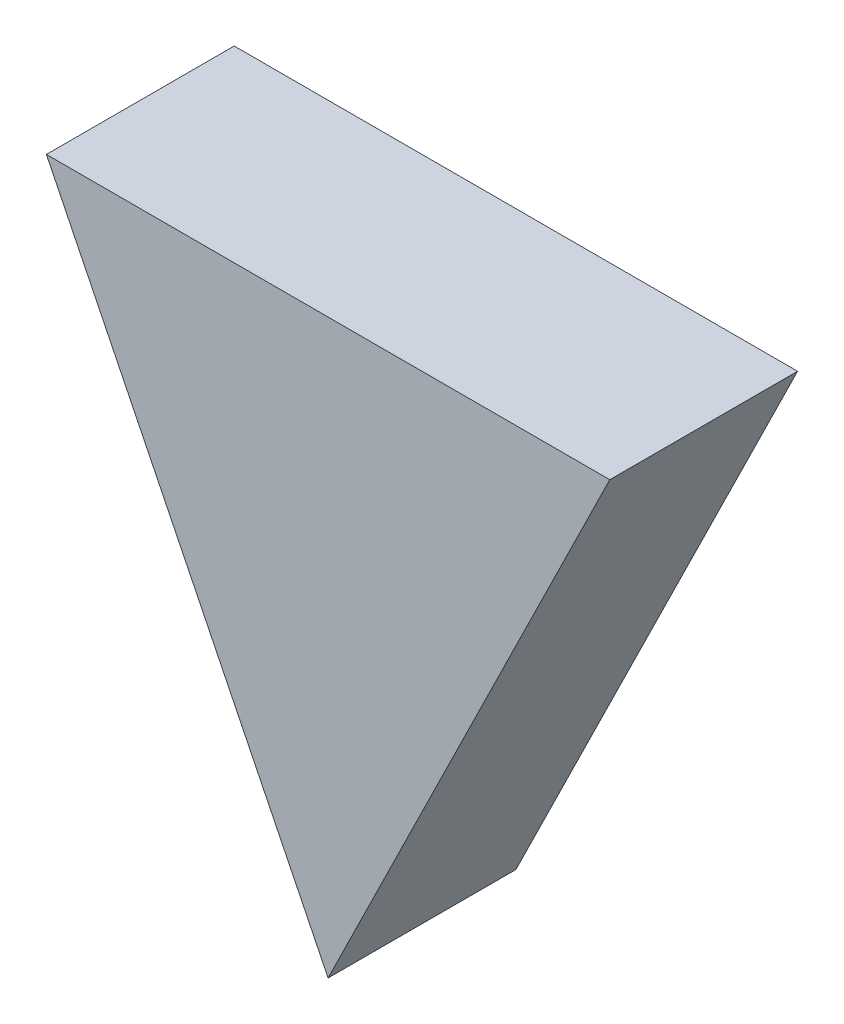
ISO-10303-21;
HEADER;
FILE_DESCRIPTION(('STEP AP214'),'2;1');
FILE_NAME('part.step','',(''),(''),'','','');
FILE_SCHEMA(('AUTOMOTIVE_DESIGN { 1 0 10303 214 1 1 1 1 }'));
ENDSEC;
DATA;
#1=APPLICATION_CONTEXT('core data for automotive mechanical design processes');
#2=APPLICATION_PROTOCOL_DEFINITION('international standard','automotive_design',2000,#1);
#3=PRODUCT_CONTEXT('',#1,'mechanical');
#4=PRODUCT('Part','Part','',(#3));
#5=PRODUCT_RELATED_PRODUCT_CATEGORY('part','',(#4));
#6=PRODUCT_DEFINITION_FORMATION('','',#4);
#7=PRODUCT_DEFINITION_CONTEXT('part definition',#1,'design');
#8=PRODUCT_DEFINITION('design','',#6,#7);
#9=PRODUCT_DEFINITION_SHAPE('','',#8);
#10=(LENGTH_UNIT() NAMED_UNIT(*) SI_UNIT(.MILLI.,.METRE.));
#11=(NAMED_UNIT(*) PLANE_ANGLE_UNIT() SI_UNIT($,.RADIAN.));
#12=(NAMED_UNIT(*) SI_UNIT($,.STERADIAN.) SOLID_ANGLE_UNIT());
#13=UNCERTAINTY_MEASURE_WITH_UNIT(LENGTH_MEASURE(1.E-05),#10,'distance_accuracy_value','');
#14=(GEOMETRIC_REPRESENTATION_CONTEXT(3) GLOBAL_UNCERTAINTY_ASSIGNED_CONTEXT((#13)) GLOBAL_UNIT_ASSIGNED_CONTEXT((#10,
#11,#12)) REPRESENTATION_CONTEXT('',''));
#15=CARTESIAN_POINT('',(0.,0.,0.));
#16=DIRECTION('',(0.,0.,1.));
#17=DIRECTION('',(1.,0.,0.));
#18=AXIS2_PLACEMENT_3D('',#15,#16,#17);
#19=CARTESIAN_POINT('',(-15.,30.48,10.));
#20=DIRECTION('',(0.897235271614275,0.441552791148758,0.));
#21=DIRECTION('',(-0.441552791148758,0.897235271614275,0.));
#22=AXIS2_PLACEMENT_3D('',#19,#20,#21);
#23=PLANE('',#22);
#24=DIRECTION('',(0.441552791148758,-0.897235271614275,0.));
#25=VECTOR('',#24,1.);
#26=CARTESIAN_POINT('',(-15.,30.48,0.));
#27=LINE('',#26,#25);
#28=CARTESIAN_POINT('',(-15.,30.48,0.));
#29=VERTEX_POINT('',#28);
#30=CARTESIAN_POINT('',(0.,0.,0.));
#31=VERTEX_POINT('',#30);
#32=EDGE_CURVE('E82',#29,#31,#27,.T.);
#33=ORIENTED_EDGE('',*,*,#32,.T.);
#34=DIRECTION('',(0.,0.,-1.));
#35=VECTOR('',#34,1.);
#36=CARTESIAN_POINT('',(0.,0.,10.));
#37=LINE('',#36,#35);
#38=CARTESIAN_POINT('',(0.,0.,10.));
#39=VERTEX_POINT('',#38);
#40=EDGE_CURVE('E11',#39,#31,#37,.T.);
#41=ORIENTED_EDGE('',*,*,#40,.F.);
#42=DIRECTION('',(0.441552791148758,-0.897235271614275,0.));
#43=VECTOR('',#42,1.);
#44=CARTESIAN_POINT('',(-15.,30.48,10.));
#45=LINE('',#44,#43);
#46=CARTESIAN_POINT('',(-15.,30.48,10.));
#47=VERTEX_POINT('',#46);
#48=EDGE_CURVE('E75',#47,#39,#45,.T.);
#49=ORIENTED_EDGE('',*,*,#48,.F.);
#50=DIRECTION('',(0.,0.,-1.));
#51=VECTOR('',#50,1.);
#52=CARTESIAN_POINT('',(-15.,30.48,10.));
#53=LINE('',#52,#51);
#54=EDGE_CURVE('E83',#47,#29,#53,.T.);
#55=ORIENTED_EDGE('',*,*,#54,.T.);
#56=EDGE_LOOP('',(#33,#41,#49,#55));
#57=FACE_BOUND('',#56,.T.);
#58=ADVANCED_FACE('F35',(#57),#23,.F.);
#59=CARTESIAN_POINT('',(0.,0.,10.));
#60=DIRECTION('',(-0.897235271614275,0.441552791148757,0.));
#61=DIRECTION('',(-0.441552791148757,-0.897235271614275,0.));
#62=AXIS2_PLACEMENT_3D('',#59,#60,#61);
#63=PLANE('',#62);
#64=DIRECTION('',(0.441552791148757,0.897235271614275,0.));
#65=VECTOR('',#64,1.);
#66=CARTESIAN_POINT('',(0.,0.,0.));
#67=LINE('',#66,#65);
#68=CARTESIAN_POINT('',(15.,30.48,0.));
#69=VERTEX_POINT('',#68);
#70=EDGE_CURVE('E63',#31,#69,#67,.T.);
#71=ORIENTED_EDGE('',*,*,#70,.T.);
#72=DIRECTION('',(0.,0.,-1.));
#73=VECTOR('',#72,1.);
#74=CARTESIAN_POINT('',(15.,30.48,10.));
#75=LINE('',#74,#73);
#76=CARTESIAN_POINT('',(15.,30.48,10.));
#77=VERTEX_POINT('',#76);
#78=EDGE_CURVE('E43',#77,#69,#75,.T.);
#79=ORIENTED_EDGE('',*,*,#78,.F.);
#80=DIRECTION('',(0.441552791148757,0.897235271614275,0.));
#81=VECTOR('',#80,1.);
#82=CARTESIAN_POINT('',(0.,0.,10.));
#83=LINE('',#82,#81);
#84=EDGE_CURVE('E71',#39,#77,#83,.T.);
#85=ORIENTED_EDGE('',*,*,#84,.F.);
#86=ORIENTED_EDGE('',*,*,#40,.T.);
#87=EDGE_LOOP('',(#71,#79,#85,#86));
#88=FACE_BOUND('',#87,.T.);
#89=ADVANCED_FACE('F72',(#88),#63,.F.);
#90=CARTESIAN_POINT('',(15.,30.48,10.));
#91=DIRECTION('',(0.,-1.,0.));
#92=DIRECTION('',(1.,0.,0.));
#93=AXIS2_PLACEMENT_3D('',#90,#91,#92);
#94=PLANE('',#93);
#95=DIRECTION('',(-1.,0.,0.));
#96=VECTOR('',#95,1.);
#97=CARTESIAN_POINT('',(15.,30.48,0.));
#98=LINE('',#97,#96);
#99=EDGE_CURVE('E68',#69,#29,#98,.T.);
#100=ORIENTED_EDGE('',*,*,#99,.T.);
#101=ORIENTED_EDGE('',*,*,#54,.F.);
#102=DIRECTION('',(-1.,0.,0.));
#103=VECTOR('',#102,1.);
#104=CARTESIAN_POINT('',(15.,30.48,10.));
#105=LINE('',#104,#103);
#106=EDGE_CURVE('E51',#77,#47,#105,.T.);
#107=ORIENTED_EDGE('',*,*,#106,.F.);
#108=ORIENTED_EDGE('',*,*,#78,.T.);
#109=EDGE_LOOP('',(#100,#101,#107,#108));
#110=FACE_BOUND('',#109,.T.);
#111=ADVANCED_FACE('F90',(#110),#94,.F.);
#112=CARTESIAN_POINT('',(0.,0.,10.));
#113=DIRECTION('',(0.,0.,-1.));
#114=DIRECTION('',(-1.,0.,0.));
#115=AXIS2_PLACEMENT_3D('',#112,#113,#114);
#116=PLANE('',#115);
#117=ORIENTED_EDGE('',*,*,#48,.T.);
#118=ORIENTED_EDGE('',*,*,#84,.T.);
#119=ORIENTED_EDGE('',*,*,#106,.T.);
#120=EDGE_LOOP('',(#117,#118,#119));
#121=FACE_BOUND('',#120,.T.);
#122=ADVANCED_FACE('F78',(#121),#116,.F.);
#123=CARTESIAN_POINT('',(0.,0.,0.));
#124=DIRECTION('',(0.,0.,-1.));
#125=DIRECTION('',(-1.,0.,0.));
#126=AXIS2_PLACEMENT_3D('',#123,#124,#125);
#127=PLANE('',#126);
#128=ORIENTED_EDGE('',*,*,#32,.F.);
#129=ORIENTED_EDGE('',*,*,#99,.F.);
#130=ORIENTED_EDGE('',*,*,#70,.F.);
#131=EDGE_LOOP('',(#128,#129,#130));
#132=FACE_BOUND('',#131,.T.);
#133=ADVANCED_FACE('F91',(#132),#127,.T.);
#134=CLOSED_SHELL('',(#58,#89,#111,#122,#133));
#135=MANIFOLD_SOLID_BREP('B2',#134);
#136=ADVANCED_BREP_SHAPE_REPRESENTATION('',(#18,#135),#14);
#137=SHAPE_DEFINITION_REPRESENTATION(#9,#136);
ENDSEC;
END-ISO-10303-21;
